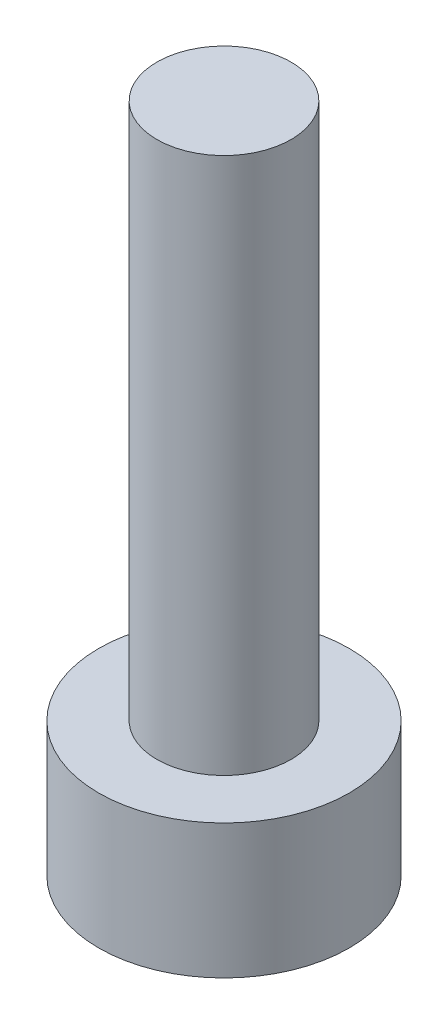
ISO-10303-21;
HEADER;
FILE_DESCRIPTION(('STEP AP214'),'2;1');
FILE_NAME('part.step','',(''),(''),'','','');
FILE_SCHEMA(('AUTOMOTIVE_DESIGN { 1 0 10303 214 1 1 1 1 }'));
ENDSEC;
DATA;
#1=APPLICATION_CONTEXT('core data for automotive mechanical design processes');
#2=APPLICATION_PROTOCOL_DEFINITION('international standard','automotive_design',2000,#1);
#3=PRODUCT_CONTEXT('',#1,'mechanical');
#4=PRODUCT('Part','Part','',(#3));
#5=PRODUCT_RELATED_PRODUCT_CATEGORY('part','',(#4));
#6=PRODUCT_DEFINITION_FORMATION('','',#4);
#7=PRODUCT_DEFINITION_CONTEXT('part definition',#1,'design');
#8=PRODUCT_DEFINITION('design','',#6,#7);
#9=PRODUCT_DEFINITION_SHAPE('','',#8);
#10=(LENGTH_UNIT() NAMED_UNIT(*) SI_UNIT(.MILLI.,.METRE.));
#11=(NAMED_UNIT(*) PLANE_ANGLE_UNIT() SI_UNIT($,.RADIAN.));
#12=(NAMED_UNIT(*) SI_UNIT($,.STERADIAN.) SOLID_ANGLE_UNIT());
#13=UNCERTAINTY_MEASURE_WITH_UNIT(LENGTH_MEASURE(1.E-05),#10,'distance_accuracy_value','');
#14=(GEOMETRIC_REPRESENTATION_CONTEXT(3) GLOBAL_UNCERTAINTY_ASSIGNED_CONTEXT((#13)) GLOBAL_UNIT_ASSIGNED_CONTEXT((#10,
#11,#12)) REPRESENTATION_CONTEXT('',''));
#15=CARTESIAN_POINT('',(0.,0.,0.));
#16=DIRECTION('',(0.,0.,1.));
#17=DIRECTION('',(1.,0.,0.));
#18=AXIS2_PLACEMENT_3D('',#15,#16,#17);
#19=CARTESIAN_POINT('',(0.,3.,0.));
#20=DIRECTION('',(0.,-1.,0.));
#21=DIRECTION('',(0.,0.,-1.));
#22=AXIS2_PLACEMENT_3D('',#19,#20,#21);
#23=CYLINDRICAL_SURFACE('',#22,2.8);
#24=CARTESIAN_POINT('',(0.,3.,0.));
#25=DIRECTION('',(0.,1.,0.));
#26=DIRECTION('',(0.,0.,1.));
#27=AXIS2_PLACEMENT_3D('',#24,#25,#26);
#28=CIRCLE('',#27,2.8);
#29=CARTESIAN_POINT('',(0.,3.,2.8));
#30=VERTEX_POINT('',#29);
#31=EDGE_CURVE('E51',#30,#30,#28,.T.);
#32=ORIENTED_EDGE('',*,*,#31,.F.);
#33=EDGE_LOOP('',(#32));
#34=FACE_BOUND('',#33,.T.);
#35=CARTESIAN_POINT('',(0.,0.,0.));
#36=DIRECTION('',(0.,1.,0.));
#37=DIRECTION('',(0.,0.,1.));
#38=AXIS2_PLACEMENT_3D('',#35,#36,#37);
#39=CIRCLE('',#38,2.8);
#40=CARTESIAN_POINT('',(0.,0.,2.8));
#41=VERTEX_POINT('',#40);
#42=EDGE_CURVE('E46',#41,#41,#39,.T.);
#43=ORIENTED_EDGE('',*,*,#42,.T.);
#44=EDGE_LOOP('',(#43));
#45=FACE_BOUND('',#44,.T.);
#46=ADVANCED_FACE('F43',(#34,#45),#23,.T.);
#47=CARTESIAN_POINT('',(0.,3.,0.));
#48=DIRECTION('',(0.,1.,0.));
#49=DIRECTION('',(0.,0.,1.));
#50=AXIS2_PLACEMENT_3D('',#47,#48,#49);
#51=PLANE('',#50);
#52=CARTESIAN_POINT('',(0.,3.,0.));
#53=DIRECTION('',(0.,1.,0.));
#54=DIRECTION('',(0.,0.,1.));
#55=AXIS2_PLACEMENT_3D('',#52,#53,#54);
#56=CIRCLE('',#55,1.5);
#57=CARTESIAN_POINT('',(0.,3.,1.5));
#58=VERTEX_POINT('',#57);
#59=EDGE_CURVE('E11',#58,#58,#56,.T.);
#60=ORIENTED_EDGE('',*,*,#59,.F.);
#61=EDGE_LOOP('',(#60));
#62=FACE_BOUND('',#61,.T.);
#63=ORIENTED_EDGE('',*,*,#31,.T.);
#64=EDGE_LOOP('',(#63));
#65=FACE_BOUND('',#64,.T.);
#66=ADVANCED_FACE('F162',(#62,#65),#51,.T.);
#67=CARTESIAN_POINT('',(0.,0.,0.));
#68=DIRECTION('',(0.,1.,0.));
#69=DIRECTION('',(0.,0.,1.));
#70=AXIS2_PLACEMENT_3D('',#67,#68,#69);
#71=PLANE('',#70);
#72=DIRECTION('',(0.195712369095071,0.,0.980661342453752));
#73=VECTOR('',#72,1.);
#74=CARTESIAN_POINT('',(1.08458344184122,0.,-0.952371823930755));
#75=LINE('',#74,#73);
#76=CARTESIAN_POINT('',(1.08458344184122,0.,-0.952371823930755));
#77=VERTEX_POINT('',#76);
#78=CARTESIAN_POINT('',(1.36706991429316,0.,0.463090901193079));
#79=VERTEX_POINT('',#78);
#80=EDGE_CURVE('E134',#77,#79,#75,.T.);
#81=ORIENTED_EDGE('',*,*,#80,.F.);
#82=DIRECTION('',(0.947133819621836,0.,0.320838787755708));
#83=VECTOR('',#82,1.);
#84=CARTESIAN_POINT('',(-0.282486472451946,0.,-1.41546272512383));
#85=LINE('',#84,#83);
#86=CARTESIAN_POINT('',(-0.282486472451946,0.,-1.41546272512383));
#87=VERTEX_POINT('',#86);
#88=EDGE_CURVE('E56',#87,#77,#85,.T.);
#89=ORIENTED_EDGE('',*,*,#88,.F.);
#90=DIRECTION('',(0.751421450526765,0.,-0.659822554698044));
#91=VECTOR('',#90,1.);
#92=CARTESIAN_POINT('',(-1.36706991429316,0.,-0.463090901193078));
#93=LINE('',#92,#91);
#94=CARTESIAN_POINT('',(-1.36706991429316,0.,-0.463090901193078));
#95=VERTEX_POINT('',#94);
#96=EDGE_CURVE('E142',#95,#87,#93,.T.);
#97=ORIENTED_EDGE('',*,*,#96,.F.);
#98=DIRECTION('',(-0.195712369095071,0.,-0.980661342453752));
#99=VECTOR('',#98,1.);
#100=CARTESIAN_POINT('',(-1.08458344184122,0.,0.952371823930756));
#101=LINE('',#100,#99);
#102=CARTESIAN_POINT('',(-1.08458344184122,0.,0.952371823930756));
#103=VERTEX_POINT('',#102);
#104=EDGE_CURVE('E139',#103,#95,#101,.T.);
#105=ORIENTED_EDGE('',*,*,#104,.F.);
#106=DIRECTION('',(-0.947133819621836,0.,-0.320838787755708));
#107=VECTOR('',#106,1.);
#108=CARTESIAN_POINT('',(0.282486472451946,0.,1.41546272512383));
#109=LINE('',#108,#107);
#110=CARTESIAN_POINT('',(0.282486472451946,0.,1.41546272512383));
#111=VERTEX_POINT('',#110);
#112=EDGE_CURVE('E110',#111,#103,#109,.T.);
#113=ORIENTED_EDGE('',*,*,#112,.F.);
#114=DIRECTION('',(-0.751421450526765,0.,0.659822554698044));
#115=VECTOR('',#114,1.);
#116=CARTESIAN_POINT('',(1.36706991429316,0.,0.463090901193079));
#117=LINE('',#116,#115);
#118=EDGE_CURVE('E136',#79,#111,#117,.T.);
#119=ORIENTED_EDGE('',*,*,#118,.F.);
#120=EDGE_LOOP('',(#81,#89,#97,#105,#113,#119));
#121=FACE_BOUND('',#120,.T.);
#122=ORIENTED_EDGE('',*,*,#42,.F.);
#123=EDGE_LOOP('',(#122));
#124=FACE_BOUND('',#123,.T.);
#125=ADVANCED_FACE('F159',(#121,#124),#71,.F.);
#126=CARTESIAN_POINT('',(0.,15.,0.));
#127=DIRECTION('',(0.,-1.,0.));
#128=DIRECTION('',(0.,0.,-1.));
#129=AXIS2_PLACEMENT_3D('',#126,#127,#128);
#130=CYLINDRICAL_SURFACE('',#129,1.5);
#131=CARTESIAN_POINT('',(0.,15.,0.));
#132=DIRECTION('',(0.,1.,0.));
#133=DIRECTION('',(0.,0.,1.));
#134=AXIS2_PLACEMENT_3D('',#131,#132,#133);
#135=CIRCLE('',#134,1.5);
#136=CARTESIAN_POINT('',(0.,15.,1.5));
#137=VERTEX_POINT('',#136);
#138=EDGE_CURVE('E148',#137,#137,#135,.T.);
#139=ORIENTED_EDGE('',*,*,#138,.F.);
#140=EDGE_LOOP('',(#139));
#141=FACE_BOUND('',#140,.T.);
#142=ORIENTED_EDGE('',*,*,#59,.T.);
#143=EDGE_LOOP('',(#142));
#144=FACE_BOUND('',#143,.T.);
#145=ADVANCED_FACE('F165',(#141,#144),#130,.T.);
#146=CARTESIAN_POINT('',(0.,15.,0.));
#147=DIRECTION('',(0.,1.,0.));
#148=DIRECTION('',(0.,0.,1.));
#149=AXIS2_PLACEMENT_3D('',#146,#147,#148);
#150=PLANE('',#149);
#151=ORIENTED_EDGE('',*,*,#138,.T.);
#152=EDGE_LOOP('',(#151));
#153=FACE_BOUND('',#152,.T.);
#154=ADVANCED_FACE('F168',(#153),#150,.T.);
#155=CARTESIAN_POINT('',(-0.282486472451946,1.5,-1.41546272512383));
#156=DIRECTION('',(0.320838787755708,0.,-0.947133819621836));
#157=DIRECTION('',(-0.947133819621836,0.,-0.320838787755708));
#158=AXIS2_PLACEMENT_3D('',#155,#156,#157);
#159=PLANE('',#158);
#160=ORIENTED_EDGE('',*,*,#88,.T.);
#161=DIRECTION('',(0.,-1.,0.));
#162=VECTOR('',#161,1.);
#163=CARTESIAN_POINT('',(1.08458344184122,1.5,-0.952371823930755));
#164=LINE('',#163,#162);
#165=CARTESIAN_POINT('',(1.08458344184122,1.5,-0.952371823930755));
#166=VERTEX_POINT('',#165);
#167=EDGE_CURVE('E90',#166,#77,#164,.T.);
#168=ORIENTED_EDGE('',*,*,#167,.F.);
#169=DIRECTION('',(0.947133819621836,0.,0.320838787755708));
#170=VECTOR('',#169,1.);
#171=CARTESIAN_POINT('',(-0.282486472451946,1.5,-1.41546272512383));
#172=LINE('',#171,#170);
#173=CARTESIAN_POINT('',(-0.282486472451946,1.5,-1.41546272512383));
#174=VERTEX_POINT('',#173);
#175=EDGE_CURVE('E145',#174,#166,#172,.T.);
#176=ORIENTED_EDGE('',*,*,#175,.F.);
#177=DIRECTION('',(0.,-1.,0.));
#178=VECTOR('',#177,1.);
#179=CARTESIAN_POINT('',(-0.282486472451946,1.5,-1.41546272512383));
#180=LINE('',#179,#178);
#181=EDGE_CURVE('E70',#174,#87,#180,.T.);
#182=ORIENTED_EDGE('',*,*,#181,.T.);
#183=EDGE_LOOP('',(#160,#168,#176,#182));
#184=FACE_BOUND('',#183,.T.);
#185=ADVANCED_FACE('F196',(#184),#159,.F.);
#186=CARTESIAN_POINT('',(-1.36706991429316,1.5,-0.463090901193078));
#187=DIRECTION('',(-0.659822554698044,0.,-0.751421450526765));
#188=DIRECTION('',(-0.751421450526765,0.,0.659822554698044));
#189=AXIS2_PLACEMENT_3D('',#186,#187,#188);
#190=PLANE('',#189);
#191=ORIENTED_EDGE('',*,*,#96,.T.);
#192=ORIENTED_EDGE('',*,*,#181,.F.);
#193=DIRECTION('',(0.751421450526765,0.,-0.659822554698044));
#194=VECTOR('',#193,1.);
#195=CARTESIAN_POINT('',(-1.36706991429316,1.5,-0.463090901193078));
#196=LINE('',#195,#194);
#197=CARTESIAN_POINT('',(-1.36706991429316,1.5,-0.463090901193078));
#198=VERTEX_POINT('',#197);
#199=EDGE_CURVE('E118',#198,#174,#196,.T.);
#200=ORIENTED_EDGE('',*,*,#199,.F.);
#201=DIRECTION('',(0.,-1.,0.));
#202=VECTOR('',#201,1.);
#203=CARTESIAN_POINT('',(-1.36706991429316,1.5,-0.463090901193078));
#204=LINE('',#203,#202);
#205=EDGE_CURVE('E112',#198,#95,#204,.T.);
#206=ORIENTED_EDGE('',*,*,#205,.T.);
#207=EDGE_LOOP('',(#191,#192,#200,#206));
#208=FACE_BOUND('',#207,.T.);
#209=ADVANCED_FACE('F209',(#208),#190,.F.);
#210=CARTESIAN_POINT('',(-1.08458344184122,1.5,0.952371823930756));
#211=DIRECTION('',(-0.980661342453752,0.,0.195712369095071));
#212=DIRECTION('',(0.195712369095071,0.,0.980661342453752));
#213=AXIS2_PLACEMENT_3D('',#210,#211,#212);
#214=PLANE('',#213);
#215=ORIENTED_EDGE('',*,*,#104,.T.);
#216=ORIENTED_EDGE('',*,*,#205,.F.);
#217=DIRECTION('',(-0.195712369095071,0.,-0.980661342453752));
#218=VECTOR('',#217,1.);
#219=CARTESIAN_POINT('',(-1.08458344184122,1.5,0.952371823930756));
#220=LINE('',#219,#218);
#221=CARTESIAN_POINT('',(-1.08458344184122,1.5,0.952371823930756));
#222=VERTEX_POINT('',#221);
#223=EDGE_CURVE('E113',#222,#198,#220,.T.);
#224=ORIENTED_EDGE('',*,*,#223,.F.);
#225=DIRECTION('',(0.,-1.,0.));
#226=VECTOR('',#225,1.);
#227=CARTESIAN_POINT('',(-1.08458344184122,1.5,0.952371823930756));
#228=LINE('',#227,#226);
#229=EDGE_CURVE('E99',#222,#103,#228,.T.);
#230=ORIENTED_EDGE('',*,*,#229,.T.);
#231=EDGE_LOOP('',(#215,#216,#224,#230));
#232=FACE_BOUND('',#231,.T.);
#233=ADVANCED_FACE('F116',(#232),#214,.F.);
#234=CARTESIAN_POINT('',(0.282486472451946,1.5,1.41546272512383));
#235=DIRECTION('',(-0.320838787755708,0.,0.947133819621836));
#236=DIRECTION('',(0.947133819621836,0.,0.320838787755708));
#237=AXIS2_PLACEMENT_3D('',#234,#235,#236);
#238=PLANE('',#237);
#239=ORIENTED_EDGE('',*,*,#112,.T.);
#240=ORIENTED_EDGE('',*,*,#229,.F.);
#241=DIRECTION('',(-0.947133819621836,0.,-0.320838787755708));
#242=VECTOR('',#241,1.);
#243=CARTESIAN_POINT('',(0.282486472451946,1.5,1.41546272512383));
#244=LINE('',#243,#242);
#245=CARTESIAN_POINT('',(0.282486472451946,1.5,1.41546272512383));
#246=VERTEX_POINT('',#245);
#247=EDGE_CURVE('E102',#246,#222,#244,.T.);
#248=ORIENTED_EDGE('',*,*,#247,.F.);
#249=DIRECTION('',(0.,-1.,0.));
#250=VECTOR('',#249,1.);
#251=CARTESIAN_POINT('',(0.282486472451946,1.5,1.41546272512383));
#252=LINE('',#251,#250);
#253=EDGE_CURVE('E115',#246,#111,#252,.T.);
#254=ORIENTED_EDGE('',*,*,#253,.T.);
#255=EDGE_LOOP('',(#239,#240,#248,#254));
#256=FACE_BOUND('',#255,.T.);
#257=ADVANCED_FACE('F105',(#256),#238,.F.);
#258=CARTESIAN_POINT('',(1.36706991429316,1.5,0.463090901193079));
#259=DIRECTION('',(0.659822554698044,0.,0.751421450526765));
#260=DIRECTION('',(0.751421450526765,0.,-0.659822554698044));
#261=AXIS2_PLACEMENT_3D('',#258,#259,#260);
#262=PLANE('',#261);
#263=ORIENTED_EDGE('',*,*,#118,.T.);
#264=ORIENTED_EDGE('',*,*,#253,.F.);
#265=DIRECTION('',(-0.751421450526765,0.,0.659822554698044));
#266=VECTOR('',#265,1.);
#267=CARTESIAN_POINT('',(1.36706991429316,1.5,0.463090901193079));
#268=LINE('',#267,#266);
#269=CARTESIAN_POINT('',(1.36706991429316,1.5,0.463090901193079));
#270=VERTEX_POINT('',#269);
#271=EDGE_CURVE('E124',#270,#246,#268,.T.);
#272=ORIENTED_EDGE('',*,*,#271,.F.);
#273=DIRECTION('',(0.,-1.,0.));
#274=VECTOR('',#273,1.);
#275=CARTESIAN_POINT('',(1.36706991429316,1.5,0.463090901193079));
#276=LINE('',#275,#274);
#277=EDGE_CURVE('E149',#270,#79,#276,.T.);
#278=ORIENTED_EDGE('',*,*,#277,.T.);
#279=EDGE_LOOP('',(#263,#264,#272,#278));
#280=FACE_BOUND('',#279,.T.);
#281=ADVANCED_FACE('F234',(#280),#262,.F.);
#282=CARTESIAN_POINT('',(1.08458344184122,1.5,-0.952371823930755));
#283=DIRECTION('',(0.980661342453752,0.,-0.195712369095071));
#284=DIRECTION('',(-0.195712369095071,0.,-0.980661342453752));
#285=AXIS2_PLACEMENT_3D('',#282,#283,#284);
#286=PLANE('',#285);
#287=ORIENTED_EDGE('',*,*,#80,.T.);
#288=ORIENTED_EDGE('',*,*,#277,.F.);
#289=DIRECTION('',(0.195712369095071,0.,0.980661342453752));
#290=VECTOR('',#289,1.);
#291=CARTESIAN_POINT('',(1.08458344184122,1.5,-0.952371823930755));
#292=LINE('',#291,#290);
#293=EDGE_CURVE('E130',#166,#270,#292,.T.);
#294=ORIENTED_EDGE('',*,*,#293,.F.);
#295=ORIENTED_EDGE('',*,*,#167,.T.);
#296=EDGE_LOOP('',(#287,#288,#294,#295));
#297=FACE_BOUND('',#296,.T.);
#298=ADVANCED_FACE('F243',(#297),#286,.F.);
#299=CARTESIAN_POINT('',(0.,1.5,0.));
#300=DIRECTION('',(0.,-1.,0.));
#301=DIRECTION('',(0.,0.,-1.));
#302=AXIS2_PLACEMENT_3D('',#299,#300,#301);
#303=PLANE('',#302);
#304=ORIENTED_EDGE('',*,*,#175,.T.);
#305=ORIENTED_EDGE('',*,*,#293,.T.);
#306=ORIENTED_EDGE('',*,*,#271,.T.);
#307=ORIENTED_EDGE('',*,*,#247,.T.);
#308=ORIENTED_EDGE('',*,*,#223,.T.);
#309=ORIENTED_EDGE('',*,*,#199,.T.);
#310=EDGE_LOOP('',(#304,#305,#306,#307,#308,#309));
#311=FACE_BOUND('',#310,.T.);
#312=ADVANCED_FACE('F125',(#311),#303,.T.);
#313=CLOSED_SHELL('',(#46,#66,#125,#145,#154,#185,#209,#233,#257,#281,#298,#312));
#314=MANIFOLD_SOLID_BREP('B2',#313);
#315=ADVANCED_BREP_SHAPE_REPRESENTATION('',(#18,#314),#14);
#316=SHAPE_DEFINITION_REPRESENTATION(#9,#315);
ENDSEC;
END-ISO-10303-21;
